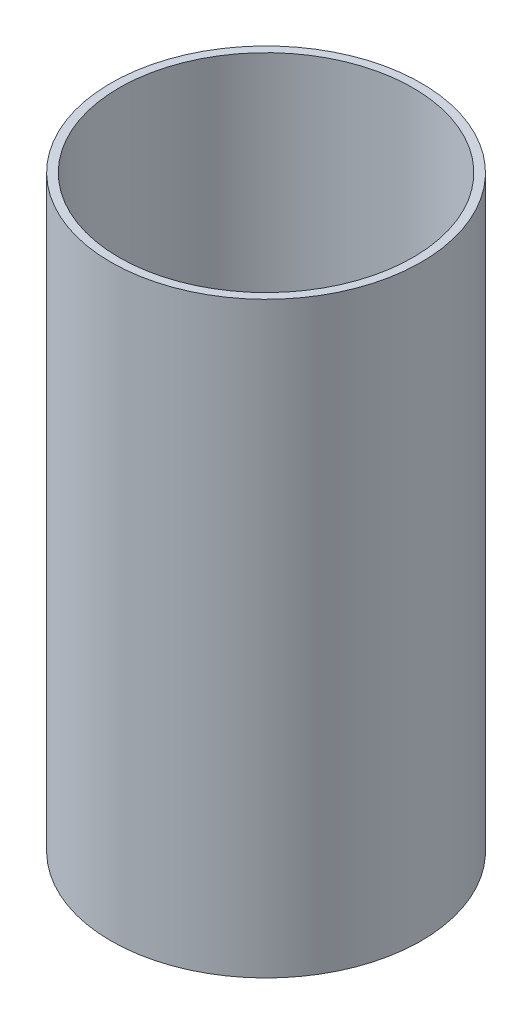
ISO-10303-21;
HEADER;
FILE_DESCRIPTION(('STEP AP214'),'2;1');
FILE_NAME('part.step','',(''),(''),'','','');
FILE_SCHEMA(('AUTOMOTIVE_DESIGN { 1 0 10303 214 1 1 1 1 }'));
ENDSEC;
DATA;
#1=APPLICATION_CONTEXT('core data for automotive mechanical design processes');
#2=APPLICATION_PROTOCOL_DEFINITION('international standard','automotive_design',2000,#1);
#3=PRODUCT_CONTEXT('',#1,'mechanical');
#4=PRODUCT('Part','Part','',(#3));
#5=PRODUCT_RELATED_PRODUCT_CATEGORY('part','',(#4));
#6=PRODUCT_DEFINITION_FORMATION('','',#4);
#7=PRODUCT_DEFINITION_CONTEXT('part definition',#1,'design');
#8=PRODUCT_DEFINITION('design','',#6,#7);
#9=PRODUCT_DEFINITION_SHAPE('','',#8);
#10=(LENGTH_UNIT() NAMED_UNIT(*) SI_UNIT(.MILLI.,.METRE.));
#11=(NAMED_UNIT(*) PLANE_ANGLE_UNIT() SI_UNIT($,.RADIAN.));
#12=(NAMED_UNIT(*) SI_UNIT($,.STERADIAN.) SOLID_ANGLE_UNIT());
#13=UNCERTAINTY_MEASURE_WITH_UNIT(LENGTH_MEASURE(1.E-05),#10,'distance_accuracy_value','');
#14=(GEOMETRIC_REPRESENTATION_CONTEXT(3) GLOBAL_UNCERTAINTY_ASSIGNED_CONTEXT((#13)) GLOBAL_UNIT_ASSIGNED_CONTEXT((#10,
#11,#12)) REPRESENTATION_CONTEXT('',''));
#15=CARTESIAN_POINT('',(0.,0.,0.));
#16=DIRECTION('',(0.,0.,1.));
#17=DIRECTION('',(1.,0.,0.));
#18=AXIS2_PLACEMENT_3D('',#15,#16,#17);
#19=CARTESIAN_POINT('',(0.,127.,0.));
#20=DIRECTION('',(0.,1.,0.));
#21=DIRECTION('',(0.,0.,1.));
#22=AXIS2_PLACEMENT_3D('',#19,#20,#21);
#23=PLANE('',#22);
#24=CARTESIAN_POINT('',(0.,127.,0.));
#25=DIRECTION('',(0.,1.,0.));
#26=DIRECTION('',(0.,0.,1.));
#27=AXIS2_PLACEMENT_3D('',#24,#25,#26);
#28=CIRCLE('',#27,33.528);
#29=CARTESIAN_POINT('',(0.,127.,33.528));
#30=VERTEX_POINT('',#29);
#31=EDGE_CURVE('E10',#30,#30,#28,.T.);
#32=ORIENTED_EDGE('',*,*,#31,.T.);
#33=EDGE_LOOP('',(#32));
#34=FACE_BOUND('',#33,.T.);
#35=CARTESIAN_POINT('',(0.,127.,0.));
#36=DIRECTION('',(0.,1.,0.));
#37=DIRECTION('',(0.,0.,1.));
#38=AXIS2_PLACEMENT_3D('',#35,#36,#37);
#39=CIRCLE('',#38,31.75);
#40=CARTESIAN_POINT('',(0.,127.,31.75));
#41=VERTEX_POINT('',#40);
#42=EDGE_CURVE('E54',#41,#41,#39,.T.);
#43=ORIENTED_EDGE('',*,*,#42,.F.);
#44=EDGE_LOOP('',(#43));
#45=FACE_BOUND('',#44,.T.);
#46=ADVANCED_FACE('F41',(#34,#45),#23,.T.);
#47=CARTESIAN_POINT('',(0.,0.,0.));
#48=DIRECTION('',(0.,1.,0.));
#49=DIRECTION('',(0.,0.,1.));
#50=AXIS2_PLACEMENT_3D('',#47,#48,#49);
#51=PLANE('',#50);
#52=CARTESIAN_POINT('',(0.,0.,0.));
#53=DIRECTION('',(0.,1.,0.));
#54=DIRECTION('',(0.,0.,1.));
#55=AXIS2_PLACEMENT_3D('',#52,#53,#54);
#56=CIRCLE('',#55,33.528);
#57=CARTESIAN_POINT('',(0.,0.,33.528));
#58=VERTEX_POINT('',#57);
#59=EDGE_CURVE('E45',#58,#58,#56,.T.);
#60=ORIENTED_EDGE('',*,*,#59,.F.);
#61=EDGE_LOOP('',(#60));
#62=FACE_BOUND('',#61,.T.);
#63=CARTESIAN_POINT('',(0.,0.,0.));
#64=DIRECTION('',(0.,1.,0.));
#65=DIRECTION('',(0.,0.,1.));
#66=AXIS2_PLACEMENT_3D('',#63,#64,#65);
#67=CIRCLE('',#66,31.75);
#68=CARTESIAN_POINT('',(0.,0.,31.75));
#69=VERTEX_POINT('',#68);
#70=EDGE_CURVE('E56',#69,#69,#67,.T.);
#71=ORIENTED_EDGE('',*,*,#70,.T.);
#72=EDGE_LOOP('',(#71));
#73=FACE_BOUND('',#72,.T.);
#74=ADVANCED_FACE('F68',(#62,#73),#51,.F.);
#75=CARTESIAN_POINT('',(0.,127.,0.));
#76=DIRECTION('',(0.,-1.,0.));
#77=DIRECTION('',(0.,0.,-1.));
#78=AXIS2_PLACEMENT_3D('',#75,#76,#77);
#79=CYLINDRICAL_SURFACE('',#78,33.528);
#80=ORIENTED_EDGE('',*,*,#31,.F.);
#81=EDGE_LOOP('',(#80));
#82=FACE_BOUND('',#81,.T.);
#83=ORIENTED_EDGE('',*,*,#59,.T.);
#84=EDGE_LOOP('',(#83));
#85=FACE_BOUND('',#84,.T.);
#86=ADVANCED_FACE('F43',(#82,#85),#79,.T.);
#87=CARTESIAN_POINT('',(0.,127.,0.));
#88=DIRECTION('',(0.,-1.,0.));
#89=DIRECTION('',(0.,0.,-1.));
#90=AXIS2_PLACEMENT_3D('',#87,#88,#89);
#91=CYLINDRICAL_SURFACE('',#90,31.75);
#92=ORIENTED_EDGE('',*,*,#42,.T.);
#93=EDGE_LOOP('',(#92));
#94=FACE_BOUND('',#93,.T.);
#95=ORIENTED_EDGE('',*,*,#70,.F.);
#96=EDGE_LOOP('',(#95));
#97=FACE_BOUND('',#96,.T.);
#98=ADVANCED_FACE('F64',(#94,#97),#91,.F.);
#99=CLOSED_SHELL('',(#46,#74,#86,#98));
#100=MANIFOLD_SOLID_BREP('B2',#99);
#101=ADVANCED_BREP_SHAPE_REPRESENTATION('',(#18,#100),#14);
#102=SHAPE_DEFINITION_REPRESENTATION(#9,#101);
ENDSEC;
END-ISO-10303-21;
